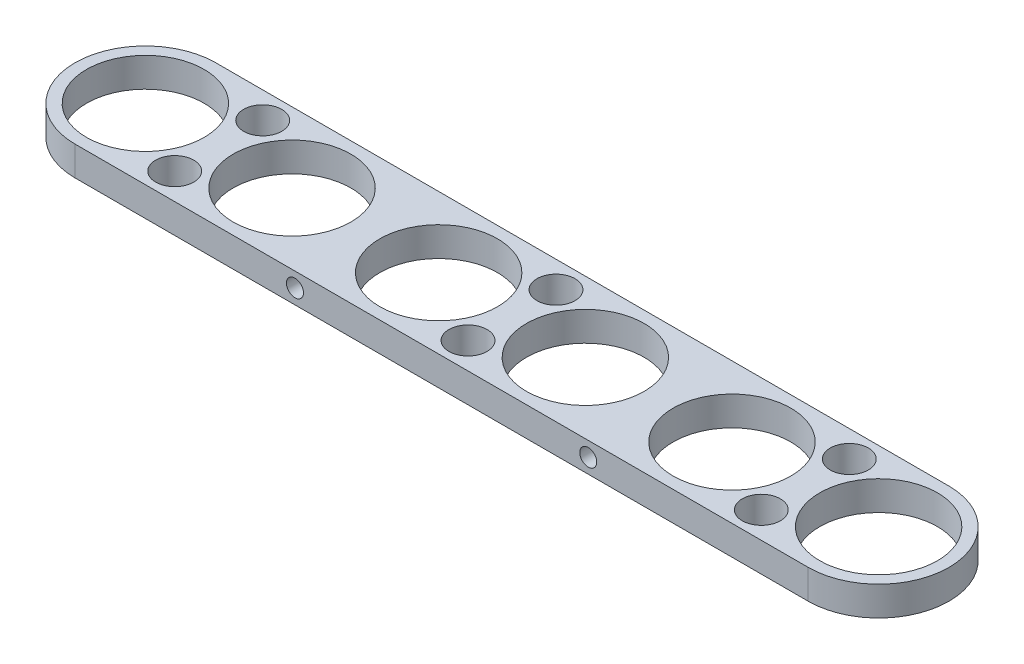
ISO-10303-21;
HEADER;
FILE_DESCRIPTION(('STEP AP214'),'2;1');
FILE_NAME('part.step','',(''),(''),'','','');
FILE_SCHEMA(('AUTOMOTIVE_DESIGN { 1 0 10303 214 1 1 1 1 }'));
ENDSEC;
DATA;
#1=APPLICATION_CONTEXT('core data for automotive mechanical design processes');
#2=APPLICATION_PROTOCOL_DEFINITION('international standard','automotive_design',2000,#1);
#3=PRODUCT_CONTEXT('',#1,'mechanical');
#4=PRODUCT('Part','Part','',(#3));
#5=PRODUCT_RELATED_PRODUCT_CATEGORY('part','',(#4));
#6=PRODUCT_DEFINITION_FORMATION('','',#4);
#7=PRODUCT_DEFINITION_CONTEXT('part definition',#1,'design');
#8=PRODUCT_DEFINITION('design','',#6,#7);
#9=PRODUCT_DEFINITION_SHAPE('','',#8);
#10=(LENGTH_UNIT() NAMED_UNIT(*) SI_UNIT(.MILLI.,.METRE.));
#11=(NAMED_UNIT(*) PLANE_ANGLE_UNIT() SI_UNIT($,.RADIAN.));
#12=(NAMED_UNIT(*) SI_UNIT($,.STERADIAN.) SOLID_ANGLE_UNIT());
#13=UNCERTAINTY_MEASURE_WITH_UNIT(LENGTH_MEASURE(1.E-05),#10,'distance_accuracy_value','');
#14=(GEOMETRIC_REPRESENTATION_CONTEXT(3) GLOBAL_UNCERTAINTY_ASSIGNED_CONTEXT((#13)) GLOBAL_UNIT_ASSIGNED_CONTEXT((#10,
#11,#12)) REPRESENTATION_CONTEXT('',''));
#15=CARTESIAN_POINT('',(0.,0.,0.));
#16=DIRECTION('',(0.,0.,1.));
#17=DIRECTION('',(1.,0.,0.));
#18=AXIS2_PLACEMENT_3D('',#15,#16,#17);
#19=CARTESIAN_POINT('',(0.,6.35,0.));
#20=DIRECTION('',(0.,1.,0.));
#21=DIRECTION('',(0.,0.,1.));
#22=AXIS2_PLACEMENT_3D('',#19,#20,#21);
#23=PLANE('',#22);
#24=CARTESIAN_POINT('',(142.875,6.35,9.525));
#25=DIRECTION('',(0.,1.,0.));
#26=DIRECTION('',(0.,0.,1.));
#27=AXIS2_PLACEMENT_3D('',#24,#25,#26);
#28=CIRCLE('',#27,4.1275);
#29=CARTESIAN_POINT('',(142.875,6.35,13.6525));
#30=VERTEX_POINT('',#29);
#31=EDGE_CURVE('E168',#30,#30,#28,.T.);
#32=ORIENTED_EDGE('',*,*,#31,.F.);
#33=EDGE_LOOP('',(#32));
#34=FACE_BOUND('',#33,.T.);
#35=CARTESIAN_POINT('',(79.375,6.35,9.525));
#36=DIRECTION('',(0.,1.,0.));
#37=DIRECTION('',(0.,0.,1.));
#38=AXIS2_PLACEMENT_3D('',#35,#36,#37);
#39=CIRCLE('',#38,4.1275);
#40=CARTESIAN_POINT('',(79.375,6.35,13.6525));
#41=VERTEX_POINT('',#40);
#42=EDGE_CURVE('E156',#41,#41,#39,.T.);
#43=ORIENTED_EDGE('',*,*,#42,.F.);
#44=EDGE_LOOP('',(#43));
#45=FACE_BOUND('',#44,.T.);
#46=CARTESIAN_POINT('',(15.875,6.35,9.525));
#47=DIRECTION('',(0.,1.,0.));
#48=DIRECTION('',(0.,0.,1.));
#49=AXIS2_PLACEMENT_3D('',#46,#47,#48);
#50=CIRCLE('',#49,4.1275);
#51=CARTESIAN_POINT('',(15.875,6.35,13.6525));
#52=VERTEX_POINT('',#51);
#53=EDGE_CURVE('E144',#52,#52,#50,.T.);
#54=ORIENTED_EDGE('',*,*,#53,.F.);
#55=EDGE_LOOP('',(#54));
#56=FACE_BOUND('',#55,.T.);
#57=CARTESIAN_POINT('',(127.,6.35,0.));
#58=DIRECTION('',(0.,1.,0.));
#59=DIRECTION('',(0.,0.,1.));
#60=AXIS2_PLACEMENT_3D('',#57,#58,#59);
#61=CIRCLE('',#60,12.744080559871);
#62=CARTESIAN_POINT('',(127.,6.35,12.744080559871));
#63=VERTEX_POINT('',#62);
#64=EDGE_CURVE('E132',#63,#63,#61,.T.);
#65=ORIENTED_EDGE('',*,*,#64,.F.);
#66=EDGE_LOOP('',(#65));
#67=FACE_BOUND('',#66,.T.);
#68=CARTESIAN_POINT('',(63.5,6.35,0.));
#69=DIRECTION('',(0.,1.,0.));
#70=DIRECTION('',(0.,0.,1.));
#71=AXIS2_PLACEMENT_3D('',#68,#69,#70);
#72=CIRCLE('',#71,12.744080559871);
#73=CARTESIAN_POINT('',(63.5,6.35,12.744080559871));
#74=VERTEX_POINT('',#73);
#75=EDGE_CURVE('E120',#74,#74,#72,.T.);
#76=ORIENTED_EDGE('',*,*,#75,.F.);
#77=EDGE_LOOP('',(#76));
#78=FACE_BOUND('',#77,.T.);
#79=CARTESIAN_POINT('',(0.,6.35,0.));
#80=DIRECTION('',(0.,1.,0.));
#81=DIRECTION('',(0.,0.,1.));
#82=AXIS2_PLACEMENT_3D('',#79,#80,#81);
#83=CIRCLE('',#82,12.744080559871);
#84=CARTESIAN_POINT('',(0.,6.35,12.744080559871));
#85=VERTEX_POINT('',#84);
#86=EDGE_CURVE('E99',#85,#85,#83,.T.);
#87=ORIENTED_EDGE('',*,*,#86,.F.);
#88=EDGE_LOOP('',(#87));
#89=FACE_BOUND('',#88,.T.);
#90=CARTESIAN_POINT('',(0.,6.35,0.));
#91=DIRECTION('',(0.,1.,0.));
#92=DIRECTION('',(0.,0.,1.));
#93=AXIS2_PLACEMENT_3D('',#90,#91,#92);
#94=CIRCLE('',#93,15.24);
#95=CARTESIAN_POINT('',(0.,6.35,-15.24));
#96=VERTEX_POINT('',#95);
#97=CARTESIAN_POINT('',(0.,6.35,15.24));
#98=VERTEX_POINT('',#97);
#99=EDGE_CURVE('E84',#96,#98,#94,.T.);
#100=ORIENTED_EDGE('',*,*,#99,.T.);
#101=DIRECTION('',(1.,0.,0.));
#102=VECTOR('',#101,1.);
#103=CARTESIAN_POINT('',(0.,6.35,15.24));
#104=LINE('',#103,#102);
#105=CARTESIAN_POINT('',(158.75,6.35,15.24));
#106=VERTEX_POINT('',#105);
#107=EDGE_CURVE('E79',#98,#106,#104,.T.);
#108=ORIENTED_EDGE('',*,*,#107,.T.);
#109=CARTESIAN_POINT('',(158.75,6.35,0.));
#110=DIRECTION('',(0.,1.,0.));
#111=DIRECTION('',(0.,0.,1.));
#112=AXIS2_PLACEMENT_3D('',#109,#110,#111);
#113=CIRCLE('',#112,15.24);
#114=CARTESIAN_POINT('',(158.75,6.35,-15.24));
#115=VERTEX_POINT('',#114);
#116=EDGE_CURVE('E82',#106,#115,#113,.T.);
#117=ORIENTED_EDGE('',*,*,#116,.T.);
#118=DIRECTION('',(-1.,0.,0.));
#119=VECTOR('',#118,1.);
#120=CARTESIAN_POINT('',(0.,6.35,-15.24));
#121=LINE('',#120,#119);
#122=EDGE_CURVE('E49',#115,#96,#121,.T.);
#123=ORIENTED_EDGE('',*,*,#122,.T.);
#124=EDGE_LOOP('',(#100,#108,#117,#123));
#125=FACE_BOUND('',#124,.T.);
#126=CARTESIAN_POINT('',(31.75,6.35,0.));
#127=DIRECTION('',(0.,1.,0.));
#128=DIRECTION('',(0.,0.,1.));
#129=AXIS2_PLACEMENT_3D('',#126,#127,#128);
#130=CIRCLE('',#129,12.744080559871);
#131=CARTESIAN_POINT('',(31.75,6.35,12.744080559871));
#132=VERTEX_POINT('',#131);
#133=EDGE_CURVE('E114',#132,#132,#130,.T.);
#134=ORIENTED_EDGE('',*,*,#133,.F.);
#135=EDGE_LOOP('',(#134));
#136=FACE_BOUND('',#135,.T.);
#137=CARTESIAN_POINT('',(95.25,6.35,0.));
#138=DIRECTION('',(0.,1.,0.));
#139=DIRECTION('',(0.,0.,1.));
#140=AXIS2_PLACEMENT_3D('',#137,#138,#139);
#141=CIRCLE('',#140,12.744080559871);
#142=CARTESIAN_POINT('',(95.25,6.35,12.744080559871));
#143=VERTEX_POINT('',#142);
#144=EDGE_CURVE('E126',#143,#143,#141,.T.);
#145=ORIENTED_EDGE('',*,*,#144,.F.);
#146=EDGE_LOOP('',(#145));
#147=FACE_BOUND('',#146,.T.);
#148=CARTESIAN_POINT('',(158.75,6.35,0.));
#149=DIRECTION('',(0.,1.,0.));
#150=DIRECTION('',(0.,0.,1.));
#151=AXIS2_PLACEMENT_3D('',#148,#149,#150);
#152=CIRCLE('',#151,12.744080559871);
#153=CARTESIAN_POINT('',(158.75,6.35,12.744080559871));
#154=VERTEX_POINT('',#153);
#155=EDGE_CURVE('E138',#154,#154,#152,.T.);
#156=ORIENTED_EDGE('',*,*,#155,.F.);
#157=EDGE_LOOP('',(#156));
#158=FACE_BOUND('',#157,.T.);
#159=CARTESIAN_POINT('',(15.875,6.35,-9.525));
#160=DIRECTION('',(0.,1.,0.));
#161=DIRECTION('',(0.,0.,-1.));
#162=AXIS2_PLACEMENT_3D('',#159,#160,#161);
#163=CIRCLE('',#162,4.12749999999999);
#164=CARTESIAN_POINT('',(15.875,6.35,-13.6525));
#165=VERTEX_POINT('',#164);
#166=EDGE_CURVE('E150',#165,#165,#163,.T.);
#167=ORIENTED_EDGE('',*,*,#166,.F.);
#168=EDGE_LOOP('',(#167));
#169=FACE_BOUND('',#168,.T.);
#170=CARTESIAN_POINT('',(79.375,6.35,-9.525));
#171=DIRECTION('',(0.,1.,0.));
#172=DIRECTION('',(0.,0.,-1.));
#173=AXIS2_PLACEMENT_3D('',#170,#171,#172);
#174=CIRCLE('',#173,4.12749999999998);
#175=CARTESIAN_POINT('',(79.375,6.35,-13.6525));
#176=VERTEX_POINT('',#175);
#177=EDGE_CURVE('E162',#176,#176,#174,.T.);
#178=ORIENTED_EDGE('',*,*,#177,.F.);
#179=EDGE_LOOP('',(#178));
#180=FACE_BOUND('',#179,.T.);
#181=CARTESIAN_POINT('',(142.875,6.35,-9.525));
#182=DIRECTION('',(0.,1.,0.));
#183=DIRECTION('',(0.,0.,-1.));
#184=AXIS2_PLACEMENT_3D('',#181,#182,#183);
#185=CIRCLE('',#184,4.1275);
#186=CARTESIAN_POINT('',(142.875,6.35,-13.6525));
#187=VERTEX_POINT('',#186);
#188=EDGE_CURVE('E174',#187,#187,#185,.T.);
#189=ORIENTED_EDGE('',*,*,#188,.F.);
#190=EDGE_LOOP('',(#189));
#191=FACE_BOUND('',#190,.T.);
#192=ADVANCED_FACE('F32',(#34,#45,#56,#67,#78,#89,#125,#136,#147,#158,#169,#180,#191),#23,.T.);
#193=CARTESIAN_POINT('',(0.,0.,0.));
#194=DIRECTION('',(0.,1.,0.));
#195=DIRECTION('',(0.,0.,1.));
#196=AXIS2_PLACEMENT_3D('',#193,#194,#195);
#197=PLANE('',#196);
#198=CARTESIAN_POINT('',(0.,0.,0.));
#199=DIRECTION('',(0.,1.,0.));
#200=DIRECTION('',(0.,0.,1.));
#201=AXIS2_PLACEMENT_3D('',#198,#199,#200);
#202=CIRCLE('',#201,15.24);
#203=CARTESIAN_POINT('',(0.,0.,-15.24));
#204=VERTEX_POINT('',#203);
#205=CARTESIAN_POINT('',(0.,0.,15.24));
#206=VERTEX_POINT('',#205);
#207=EDGE_CURVE('E96',#204,#206,#202,.T.);
#208=ORIENTED_EDGE('',*,*,#207,.F.);
#209=DIRECTION('',(-1.,0.,0.));
#210=VECTOR('',#209,1.);
#211=CARTESIAN_POINT('',(0.,0.,-15.24));
#212=LINE('',#211,#210);
#213=CARTESIAN_POINT('',(158.75,0.,-15.24));
#214=VERTEX_POINT('',#213);
#215=EDGE_CURVE('E72',#214,#204,#212,.T.);
#216=ORIENTED_EDGE('',*,*,#215,.F.);
#217=CARTESIAN_POINT('',(158.75,0.,0.));
#218=DIRECTION('',(0.,1.,0.));
#219=DIRECTION('',(0.,0.,1.));
#220=AXIS2_PLACEMENT_3D('',#217,#218,#219);
#221=CIRCLE('',#220,15.24);
#222=CARTESIAN_POINT('',(158.75,0.,15.24));
#223=VERTEX_POINT('',#222);
#224=EDGE_CURVE('E66',#223,#214,#221,.T.);
#225=ORIENTED_EDGE('',*,*,#224,.F.);
#226=DIRECTION('',(1.,0.,0.));
#227=VECTOR('',#226,1.);
#228=CARTESIAN_POINT('',(0.,0.,15.24));
#229=LINE('',#228,#227);
#230=EDGE_CURVE('E88',#206,#223,#229,.T.);
#231=ORIENTED_EDGE('',*,*,#230,.F.);
#232=EDGE_LOOP('',(#208,#216,#225,#231));
#233=FACE_BOUND('',#232,.T.);
#234=CARTESIAN_POINT('',(0.,0.,0.));
#235=DIRECTION('',(0.,1.,0.));
#236=DIRECTION('',(0.,0.,1.));
#237=AXIS2_PLACEMENT_3D('',#234,#235,#236);
#238=CIRCLE('',#237,12.744080559871);
#239=CARTESIAN_POINT('',(0.,0.,12.744080559871));
#240=VERTEX_POINT('',#239);
#241=EDGE_CURVE('E111',#240,#240,#238,.T.);
#242=ORIENTED_EDGE('',*,*,#241,.T.);
#243=EDGE_LOOP('',(#242));
#244=FACE_BOUND('',#243,.T.);
#245=CARTESIAN_POINT('',(31.75,0.,0.));
#246=DIRECTION('',(0.,1.,0.));
#247=DIRECTION('',(0.,0.,1.));
#248=AXIS2_PLACEMENT_3D('',#245,#246,#247);
#249=CIRCLE('',#248,12.744080559871);
#250=CARTESIAN_POINT('',(31.75,0.,12.744080559871));
#251=VERTEX_POINT('',#250);
#252=EDGE_CURVE('E117',#251,#251,#249,.T.);
#253=ORIENTED_EDGE('',*,*,#252,.T.);
#254=EDGE_LOOP('',(#253));
#255=FACE_BOUND('',#254,.T.);
#256=CARTESIAN_POINT('',(63.5,0.,0.));
#257=DIRECTION('',(0.,1.,0.));
#258=DIRECTION('',(0.,0.,1.));
#259=AXIS2_PLACEMENT_3D('',#256,#257,#258);
#260=CIRCLE('',#259,12.744080559871);
#261=CARTESIAN_POINT('',(63.5,0.,12.744080559871));
#262=VERTEX_POINT('',#261);
#263=EDGE_CURVE('E123',#262,#262,#260,.T.);
#264=ORIENTED_EDGE('',*,*,#263,.T.);
#265=EDGE_LOOP('',(#264));
#266=FACE_BOUND('',#265,.T.);
#267=CARTESIAN_POINT('',(95.25,0.,0.));
#268=DIRECTION('',(0.,1.,0.));
#269=DIRECTION('',(0.,0.,1.));
#270=AXIS2_PLACEMENT_3D('',#267,#268,#269);
#271=CIRCLE('',#270,12.744080559871);
#272=CARTESIAN_POINT('',(95.25,0.,12.744080559871));
#273=VERTEX_POINT('',#272);
#274=EDGE_CURVE('E129',#273,#273,#271,.T.);
#275=ORIENTED_EDGE('',*,*,#274,.T.);
#276=EDGE_LOOP('',(#275));
#277=FACE_BOUND('',#276,.T.);
#278=CARTESIAN_POINT('',(127.,0.,0.));
#279=DIRECTION('',(0.,1.,0.));
#280=DIRECTION('',(0.,0.,1.));
#281=AXIS2_PLACEMENT_3D('',#278,#279,#280);
#282=CIRCLE('',#281,12.744080559871);
#283=CARTESIAN_POINT('',(127.,0.,12.744080559871));
#284=VERTEX_POINT('',#283);
#285=EDGE_CURVE('E135',#284,#284,#282,.T.);
#286=ORIENTED_EDGE('',*,*,#285,.T.);
#287=EDGE_LOOP('',(#286));
#288=FACE_BOUND('',#287,.T.);
#289=CARTESIAN_POINT('',(158.75,0.,0.));
#290=DIRECTION('',(0.,1.,0.));
#291=DIRECTION('',(0.,0.,1.));
#292=AXIS2_PLACEMENT_3D('',#289,#290,#291);
#293=CIRCLE('',#292,12.744080559871);
#294=CARTESIAN_POINT('',(158.75,0.,12.744080559871));
#295=VERTEX_POINT('',#294);
#296=EDGE_CURVE('E141',#295,#295,#293,.T.);
#297=ORIENTED_EDGE('',*,*,#296,.T.);
#298=EDGE_LOOP('',(#297));
#299=FACE_BOUND('',#298,.T.);
#300=CARTESIAN_POINT('',(15.875,0.,9.525));
#301=DIRECTION('',(0.,1.,0.));
#302=DIRECTION('',(0.,0.,1.));
#303=AXIS2_PLACEMENT_3D('',#300,#301,#302);
#304=CIRCLE('',#303,4.1275);
#305=CARTESIAN_POINT('',(15.875,0.,13.6525));
#306=VERTEX_POINT('',#305);
#307=EDGE_CURVE('E147',#306,#306,#304,.T.);
#308=ORIENTED_EDGE('',*,*,#307,.T.);
#309=EDGE_LOOP('',(#308));
#310=FACE_BOUND('',#309,.T.);
#311=CARTESIAN_POINT('',(15.875,0.,-9.525));
#312=DIRECTION('',(0.,1.,0.));
#313=DIRECTION('',(0.,0.,-1.));
#314=AXIS2_PLACEMENT_3D('',#311,#312,#313);
#315=CIRCLE('',#314,4.12749999999999);
#316=CARTESIAN_POINT('',(15.875,0.,-13.6525));
#317=VERTEX_POINT('',#316);
#318=EDGE_CURVE('E153',#317,#317,#315,.T.);
#319=ORIENTED_EDGE('',*,*,#318,.T.);
#320=EDGE_LOOP('',(#319));
#321=FACE_BOUND('',#320,.T.);
#322=CARTESIAN_POINT('',(79.375,0.,9.525));
#323=DIRECTION('',(0.,1.,0.));
#324=DIRECTION('',(0.,0.,1.));
#325=AXIS2_PLACEMENT_3D('',#322,#323,#324);
#326=CIRCLE('',#325,4.1275);
#327=CARTESIAN_POINT('',(79.375,0.,13.6525));
#328=VERTEX_POINT('',#327);
#329=EDGE_CURVE('E159',#328,#328,#326,.T.);
#330=ORIENTED_EDGE('',*,*,#329,.T.);
#331=EDGE_LOOP('',(#330));
#332=FACE_BOUND('',#331,.T.);
#333=CARTESIAN_POINT('',(79.375,0.,-9.525));
#334=DIRECTION('',(0.,1.,0.));
#335=DIRECTION('',(0.,0.,-1.));
#336=AXIS2_PLACEMENT_3D('',#333,#334,#335);
#337=CIRCLE('',#336,4.12749999999998);
#338=CARTESIAN_POINT('',(79.375,0.,-13.6525));
#339=VERTEX_POINT('',#338);
#340=EDGE_CURVE('E165',#339,#339,#337,.T.);
#341=ORIENTED_EDGE('',*,*,#340,.T.);
#342=EDGE_LOOP('',(#341));
#343=FACE_BOUND('',#342,.T.);
#344=CARTESIAN_POINT('',(142.875,0.,9.525));
#345=DIRECTION('',(0.,1.,0.));
#346=DIRECTION('',(0.,0.,1.));
#347=AXIS2_PLACEMENT_3D('',#344,#345,#346);
#348=CIRCLE('',#347,4.1275);
#349=CARTESIAN_POINT('',(142.875,0.,13.6525));
#350=VERTEX_POINT('',#349);
#351=EDGE_CURVE('E171',#350,#350,#348,.T.);
#352=ORIENTED_EDGE('',*,*,#351,.T.);
#353=EDGE_LOOP('',(#352));
#354=FACE_BOUND('',#353,.T.);
#355=CARTESIAN_POINT('',(142.875,0.,-9.525));
#356=DIRECTION('',(0.,1.,0.));
#357=DIRECTION('',(0.,0.,-1.));
#358=AXIS2_PLACEMENT_3D('',#355,#356,#357);
#359=CIRCLE('',#358,4.1275);
#360=CARTESIAN_POINT('',(142.875,0.,-13.6525));
#361=VERTEX_POINT('',#360);
#362=EDGE_CURVE('E177',#361,#361,#359,.T.);
#363=ORIENTED_EDGE('',*,*,#362,.T.);
#364=EDGE_LOOP('',(#363));
#365=FACE_BOUND('',#364,.T.);
#366=ADVANCED_FACE('F107',(#233,#244,#255,#266,#277,#288,#299,#310,#321,#332,#343,#354,#365),
#197,.F.);
#367=CARTESIAN_POINT('',(0.,6.35,0.));
#368=DIRECTION('',(0.,-1.,0.));
#369=DIRECTION('',(0.,0.,-1.));
#370=AXIS2_PLACEMENT_3D('',#367,#368,#369);
#371=CYLINDRICAL_SURFACE('',#370,15.24);
#372=ORIENTED_EDGE('',*,*,#207,.T.);
#373=DIRECTION('',(0.,-1.,0.));
#374=VECTOR('',#373,1.);
#375=CARTESIAN_POINT('',(0.,6.35,15.24));
#376=LINE('',#375,#374);
#377=EDGE_CURVE('E11',#98,#206,#376,.T.);
#378=ORIENTED_EDGE('',*,*,#377,.F.);
#379=ORIENTED_EDGE('',*,*,#99,.F.);
#380=DIRECTION('',(0.,-1.,0.));
#381=VECTOR('',#380,1.);
#382=CARTESIAN_POINT('',(0.,6.35,-15.24));
#383=LINE('',#382,#381);
#384=EDGE_CURVE('E92',#96,#204,#383,.T.);
#385=ORIENTED_EDGE('',*,*,#384,.T.);
#386=EDGE_LOOP('',(#372,#378,#379,#385));
#387=FACE_BOUND('',#386,.T.);
#388=ADVANCED_FACE('F34',(#387),#371,.T.);
#389=CARTESIAN_POINT('',(0.,6.35,15.24));
#390=DIRECTION('',(0.,0.,-1.));
#391=DIRECTION('',(-1.,0.,0.));
#392=AXIS2_PLACEMENT_3D('',#389,#390,#391);
#393=PLANE('',#392);
#394=CARTESIAN_POINT('',(47.6250000000001,3.175,15.24));
#395=DIRECTION('',(0.,0.,-1.));
#396=DIRECTION('',(1.,0.,0.));
#397=AXIS2_PLACEMENT_3D('',#394,#395,#396);
#398=CIRCLE('',#397,1.8415);
#399=CARTESIAN_POINT('',(45.7835000000001,3.175,15.24));
#400=VERTEX_POINT('',#399);
#401=EDGE_CURVE('E186',#400,#400,#398,.T.);
#402=ORIENTED_EDGE('',*,*,#401,.T.);
#403=EDGE_LOOP('',(#402));
#404=FACE_BOUND('',#403,.T.);
#405=CARTESIAN_POINT('',(111.125,3.175,15.24));
#406=DIRECTION('',(0.,0.,-1.));
#407=DIRECTION('',(-1.,0.,0.));
#408=AXIS2_PLACEMENT_3D('',#405,#406,#407);
#409=CIRCLE('',#408,1.8415);
#410=CARTESIAN_POINT('',(109.2835,3.175,15.24));
#411=VERTEX_POINT('',#410);
#412=EDGE_CURVE('E180',#411,#411,#409,.T.);
#413=ORIENTED_EDGE('',*,*,#412,.T.);
#414=EDGE_LOOP('',(#413));
#415=FACE_BOUND('',#414,.T.);
#416=ORIENTED_EDGE('',*,*,#230,.T.);
#417=DIRECTION('',(0.,-1.,0.));
#418=VECTOR('',#417,1.);
#419=CARTESIAN_POINT('',(158.75,6.35,15.24));
#420=LINE('',#419,#418);
#421=EDGE_CURVE('E41',#106,#223,#420,.T.);
#422=ORIENTED_EDGE('',*,*,#421,.F.);
#423=ORIENTED_EDGE('',*,*,#107,.F.);
#424=ORIENTED_EDGE('',*,*,#377,.T.);
#425=EDGE_LOOP('',(#416,#422,#423,#424));
#426=FACE_BOUND('',#425,.T.);
#427=ADVANCED_FACE('F87',(#404,#415,#426),#393,.F.);
#428=CARTESIAN_POINT('',(158.75,6.35,0.));
#429=DIRECTION('',(0.,-1.,0.));
#430=DIRECTION('',(0.,0.,-1.));
#431=AXIS2_PLACEMENT_3D('',#428,#429,#430);
#432=CYLINDRICAL_SURFACE('',#431,15.24);
#433=ORIENTED_EDGE('',*,*,#224,.T.);
#434=DIRECTION('',(0.,-1.,0.));
#435=VECTOR('',#434,1.);
#436=CARTESIAN_POINT('',(158.75,6.35,-15.24));
#437=LINE('',#436,#435);
#438=EDGE_CURVE('E89',#115,#214,#437,.T.);
#439=ORIENTED_EDGE('',*,*,#438,.F.);
#440=ORIENTED_EDGE('',*,*,#116,.F.);
#441=ORIENTED_EDGE('',*,*,#421,.T.);
#442=EDGE_LOOP('',(#433,#439,#440,#441));
#443=FACE_BOUND('',#442,.T.);
#444=ADVANCED_FACE('F90',(#443),#432,.T.);
#445=CARTESIAN_POINT('',(0.,6.35,-15.24));
#446=DIRECTION('',(0.,0.,1.));
#447=DIRECTION('',(1.,0.,0.));
#448=AXIS2_PLACEMENT_3D('',#445,#446,#447);
#449=PLANE('',#448);
#450=CARTESIAN_POINT('',(47.6250000000001,3.175,-15.24));
#451=DIRECTION('',(0.,0.,-1.));
#452=DIRECTION('',(1.,0.,0.));
#453=AXIS2_PLACEMENT_3D('',#450,#451,#452);
#454=CIRCLE('',#453,1.8415);
#455=CARTESIAN_POINT('',(45.7835000000001,3.175,-15.24));
#456=VERTEX_POINT('',#455);
#457=EDGE_CURVE('E189',#456,#456,#454,.T.);
#458=ORIENTED_EDGE('',*,*,#457,.F.);
#459=EDGE_LOOP('',(#458));
#460=FACE_BOUND('',#459,.T.);
#461=CARTESIAN_POINT('',(111.125,3.175,-15.24));
#462=DIRECTION('',(0.,0.,-1.));
#463=DIRECTION('',(-1.,0.,0.));
#464=AXIS2_PLACEMENT_3D('',#461,#462,#463);
#465=CIRCLE('',#464,1.8415);
#466=CARTESIAN_POINT('',(109.2835,3.175,-15.24));
#467=VERTEX_POINT('',#466);
#468=EDGE_CURVE('E183',#467,#467,#465,.T.);
#469=ORIENTED_EDGE('',*,*,#468,.F.);
#470=EDGE_LOOP('',(#469));
#471=FACE_BOUND('',#470,.T.);
#472=ORIENTED_EDGE('',*,*,#215,.T.);
#473=ORIENTED_EDGE('',*,*,#384,.F.);
#474=ORIENTED_EDGE('',*,*,#122,.F.);
#475=ORIENTED_EDGE('',*,*,#438,.T.);
#476=EDGE_LOOP('',(#472,#473,#474,#475));
#477=FACE_BOUND('',#476,.T.);
#478=ADVANCED_FACE('F104',(#460,#471,#477),#449,.F.);
#479=CARTESIAN_POINT('',(0.,6.35,0.));
#480=DIRECTION('',(0.,-1.,0.));
#481=DIRECTION('',(0.,0.,-1.));
#482=AXIS2_PLACEMENT_3D('',#479,#480,#481);
#483=CYLINDRICAL_SURFACE('',#482,12.744080559871);
#484=ORIENTED_EDGE('',*,*,#86,.T.);
#485=EDGE_LOOP('',(#484));
#486=FACE_BOUND('',#485,.T.);
#487=ORIENTED_EDGE('',*,*,#241,.F.);
#488=EDGE_LOOP('',(#487));
#489=FACE_BOUND('',#488,.T.);
#490=ADVANCED_FACE('F206',(#486,#489),#483,.F.);
#491=CARTESIAN_POINT('',(31.75,6.35,0.));
#492=DIRECTION('',(0.,-1.,0.));
#493=DIRECTION('',(0.,0.,-1.));
#494=AXIS2_PLACEMENT_3D('',#491,#492,#493);
#495=CYLINDRICAL_SURFACE('',#494,12.744080559871);
#496=ORIENTED_EDGE('',*,*,#133,.T.);
#497=EDGE_LOOP('',(#496));
#498=FACE_BOUND('',#497,.T.);
#499=ORIENTED_EDGE('',*,*,#252,.F.);
#500=EDGE_LOOP('',(#499));
#501=FACE_BOUND('',#500,.T.);
#502=ADVANCED_FACE('F275',(#498,#501),#495,.F.);
#503=CARTESIAN_POINT('',(63.5,6.35,0.));
#504=DIRECTION('',(0.,-1.,0.));
#505=DIRECTION('',(0.,0.,-1.));
#506=AXIS2_PLACEMENT_3D('',#503,#504,#505);
#507=CYLINDRICAL_SURFACE('',#506,12.744080559871);
#508=ORIENTED_EDGE('',*,*,#75,.T.);
#509=EDGE_LOOP('',(#508));
#510=FACE_BOUND('',#509,.T.);
#511=ORIENTED_EDGE('',*,*,#263,.F.);
#512=EDGE_LOOP('',(#511));
#513=FACE_BOUND('',#512,.T.);
#514=ADVANCED_FACE('F283',(#510,#513),#507,.F.);
#515=CARTESIAN_POINT('',(95.25,6.35,0.));
#516=DIRECTION('',(0.,-1.,0.));
#517=DIRECTION('',(0.,0.,-1.));
#518=AXIS2_PLACEMENT_3D('',#515,#516,#517);
#519=CYLINDRICAL_SURFACE('',#518,12.744080559871);
#520=ORIENTED_EDGE('',*,*,#144,.T.);
#521=EDGE_LOOP('',(#520));
#522=FACE_BOUND('',#521,.T.);
#523=ORIENTED_EDGE('',*,*,#274,.F.);
#524=EDGE_LOOP('',(#523));
#525=FACE_BOUND('',#524,.T.);
#526=ADVANCED_FACE('F291',(#522,#525),#519,.F.);
#527=CARTESIAN_POINT('',(127.,6.35,0.));
#528=DIRECTION('',(0.,-1.,0.));
#529=DIRECTION('',(0.,0.,-1.));
#530=AXIS2_PLACEMENT_3D('',#527,#528,#529);
#531=CYLINDRICAL_SURFACE('',#530,12.744080559871);
#532=ORIENTED_EDGE('',*,*,#64,.T.);
#533=EDGE_LOOP('',(#532));
#534=FACE_BOUND('',#533,.T.);
#535=ORIENTED_EDGE('',*,*,#285,.F.);
#536=EDGE_LOOP('',(#535));
#537=FACE_BOUND('',#536,.T.);
#538=ADVANCED_FACE('F300',(#534,#537),#531,.F.);
#539=CARTESIAN_POINT('',(158.75,6.35,0.));
#540=DIRECTION('',(0.,-1.,0.));
#541=DIRECTION('',(0.,0.,-1.));
#542=AXIS2_PLACEMENT_3D('',#539,#540,#541);
#543=CYLINDRICAL_SURFACE('',#542,12.744080559871);
#544=ORIENTED_EDGE('',*,*,#155,.T.);
#545=EDGE_LOOP('',(#544));
#546=FACE_BOUND('',#545,.T.);
#547=ORIENTED_EDGE('',*,*,#296,.F.);
#548=EDGE_LOOP('',(#547));
#549=FACE_BOUND('',#548,.T.);
#550=ADVANCED_FACE('F309',(#546,#549),#543,.F.);
#551=CARTESIAN_POINT('',(15.875,6.35,9.525));
#552=DIRECTION('',(0.,-1.,0.));
#553=DIRECTION('',(0.,0.,-1.));
#554=AXIS2_PLACEMENT_3D('',#551,#552,#553);
#555=CYLINDRICAL_SURFACE('',#554,4.1275);
#556=ORIENTED_EDGE('',*,*,#53,.T.);
#557=EDGE_LOOP('',(#556));
#558=FACE_BOUND('',#557,.T.);
#559=ORIENTED_EDGE('',*,*,#307,.F.);
#560=EDGE_LOOP('',(#559));
#561=FACE_BOUND('',#560,.T.);
#562=ADVANCED_FACE('F318',(#558,#561),#555,.F.);
#563=CARTESIAN_POINT('',(15.875,6.35,-9.525));
#564=DIRECTION('',(0.,-1.,0.));
#565=DIRECTION('',(0.,0.,-1.));
#566=AXIS2_PLACEMENT_3D('',#563,#564,#565);
#567=CYLINDRICAL_SURFACE('',#566,4.12749999999999);
#568=ORIENTED_EDGE('',*,*,#166,.T.);
#569=EDGE_LOOP('',(#568));
#570=FACE_BOUND('',#569,.T.);
#571=ORIENTED_EDGE('',*,*,#318,.F.);
#572=EDGE_LOOP('',(#571));
#573=FACE_BOUND('',#572,.T.);
#574=ADVANCED_FACE('F327',(#570,#573),#567,.F.);
#575=CARTESIAN_POINT('',(79.375,6.35,9.525));
#576=DIRECTION('',(0.,-1.,0.));
#577=DIRECTION('',(0.,0.,-1.));
#578=AXIS2_PLACEMENT_3D('',#575,#576,#577);
#579=CYLINDRICAL_SURFACE('',#578,4.1275);
#580=ORIENTED_EDGE('',*,*,#42,.T.);
#581=EDGE_LOOP('',(#580));
#582=FACE_BOUND('',#581,.T.);
#583=ORIENTED_EDGE('',*,*,#329,.F.);
#584=EDGE_LOOP('',(#583));
#585=FACE_BOUND('',#584,.T.);
#586=ADVANCED_FACE('F336',(#582,#585),#579,.F.);
#587=CARTESIAN_POINT('',(79.375,6.35,-9.525));
#588=DIRECTION('',(0.,-1.,0.));
#589=DIRECTION('',(0.,0.,-1.));
#590=AXIS2_PLACEMENT_3D('',#587,#588,#589);
#591=CYLINDRICAL_SURFACE('',#590,4.12749999999998);
#592=ORIENTED_EDGE('',*,*,#177,.T.);
#593=EDGE_LOOP('',(#592));
#594=FACE_BOUND('',#593,.T.);
#595=ORIENTED_EDGE('',*,*,#340,.F.);
#596=EDGE_LOOP('',(#595));
#597=FACE_BOUND('',#596,.T.);
#598=ADVANCED_FACE('F345',(#594,#597),#591,.F.);
#599=CARTESIAN_POINT('',(142.875,6.35,9.525));
#600=DIRECTION('',(0.,-1.,0.));
#601=DIRECTION('',(0.,0.,-1.));
#602=AXIS2_PLACEMENT_3D('',#599,#600,#601);
#603=CYLINDRICAL_SURFACE('',#602,4.1275);
#604=ORIENTED_EDGE('',*,*,#31,.T.);
#605=EDGE_LOOP('',(#604));
#606=FACE_BOUND('',#605,.T.);
#607=ORIENTED_EDGE('',*,*,#351,.F.);
#608=EDGE_LOOP('',(#607));
#609=FACE_BOUND('',#608,.T.);
#610=ADVANCED_FACE('F217',(#606,#609),#603,.F.);
#611=CARTESIAN_POINT('',(142.875,6.35,-9.525));
#612=DIRECTION('',(0.,-1.,0.));
#613=DIRECTION('',(0.,0.,-1.));
#614=AXIS2_PLACEMENT_3D('',#611,#612,#613);
#615=CYLINDRICAL_SURFACE('',#614,4.1275);
#616=ORIENTED_EDGE('',*,*,#188,.T.);
#617=EDGE_LOOP('',(#616));
#618=FACE_BOUND('',#617,.T.);
#619=ORIENTED_EDGE('',*,*,#362,.F.);
#620=EDGE_LOOP('',(#619));
#621=FACE_BOUND('',#620,.T.);
#622=ADVANCED_FACE('F211',(#618,#621),#615,.F.);
#623=CARTESIAN_POINT('',(111.125,3.175,15.24));
#624=DIRECTION('',(0.,0.,-1.));
#625=DIRECTION('',(-1.,0.,0.));
#626=AXIS2_PLACEMENT_3D('',#623,#624,#625);
#627=CYLINDRICAL_SURFACE('',#626,1.8415);
#628=CARTESIAN_POINT('',(109.2835,3.175,15.24));
#629=CARTESIAN_POINT('',(109.2835,3.175,14.9225));
#630=CARTESIAN_POINT('',(109.2835,3.175,14.605));
#631=CARTESIAN_POINT('',(109.2835,3.175,13.97));
#632=CARTESIAN_POINT('',(109.2835,3.175,13.6525));
#633=CARTESIAN_POINT('',(109.2835,3.175,13.0175));
#634=CARTESIAN_POINT('',(109.2835,3.175,12.7));
#635=CARTESIAN_POINT('',(109.2835,3.175,12.065));
#636=CARTESIAN_POINT('',(109.2835,3.175,11.7475));
#637=CARTESIAN_POINT('',(109.2835,3.175,11.1125));
#638=CARTESIAN_POINT('',(109.2835,3.175,10.795));
#639=CARTESIAN_POINT('',(109.2835,3.175,10.16));
#640=CARTESIAN_POINT('',(109.2835,3.175,9.8425));
#641=CARTESIAN_POINT('',(109.2835,3.175,9.2075));
#642=CARTESIAN_POINT('',(109.2835,3.175,8.89));
#643=CARTESIAN_POINT('',(109.2835,3.175,8.255));
#644=CARTESIAN_POINT('',(109.2835,3.175,7.9375));
#645=CARTESIAN_POINT('',(109.2835,3.175,7.3025));
#646=CARTESIAN_POINT('',(109.2835,3.175,6.985));
#647=CARTESIAN_POINT('',(109.2835,3.175,6.35));
#648=CARTESIAN_POINT('',(109.2835,3.175,6.0325));
#649=CARTESIAN_POINT('',(109.2835,3.175,5.3975));
#650=CARTESIAN_POINT('',(109.2835,3.175,5.08));
#651=CARTESIAN_POINT('',(109.2835,3.175,4.445));
#652=CARTESIAN_POINT('',(109.2835,3.175,4.1275));
#653=CARTESIAN_POINT('',(109.2835,3.175,3.4925));
#654=CARTESIAN_POINT('',(109.2835,3.175,3.175));
#655=CARTESIAN_POINT('',(109.2835,3.175,2.54));
#656=CARTESIAN_POINT('',(109.2835,3.175,2.2225));
#657=CARTESIAN_POINT('',(109.2835,3.175,1.5875));
#658=CARTESIAN_POINT('',(109.2835,3.175,1.27));
#659=CARTESIAN_POINT('',(109.2835,3.175,0.635000000000002));
#660=CARTESIAN_POINT('',(109.2835,3.175,0.317500000000002));
#661=CARTESIAN_POINT('',(109.2835,3.175,-0.317499999999998));
#662=CARTESIAN_POINT('',(109.2835,3.175,-0.634999999999997));
#663=CARTESIAN_POINT('',(109.2835,3.175,-1.27));
#664=CARTESIAN_POINT('',(109.2835,3.175,-1.5875));
#665=CARTESIAN_POINT('',(109.2835,3.175,-2.2225));
#666=CARTESIAN_POINT('',(109.2835,3.175,-2.54));
#667=CARTESIAN_POINT('',(109.2835,3.175,-3.175));
#668=CARTESIAN_POINT('',(109.2835,3.175,-3.4925));
#669=CARTESIAN_POINT('',(109.2835,3.175,-4.1275));
#670=CARTESIAN_POINT('',(109.2835,3.175,-4.445));
#671=CARTESIAN_POINT('',(109.2835,3.175,-5.08));
#672=CARTESIAN_POINT('',(109.2835,3.175,-5.3975));
#673=CARTESIAN_POINT('',(109.2835,3.175,-6.0325));
#674=CARTESIAN_POINT('',(109.2835,3.175,-6.35));
#675=CARTESIAN_POINT('',(109.2835,3.175,-6.985));
#676=CARTESIAN_POINT('',(109.2835,3.175,-7.3025));
#677=CARTESIAN_POINT('',(109.2835,3.175,-7.9375));
#678=CARTESIAN_POINT('',(109.2835,3.175,-8.255));
#679=CARTESIAN_POINT('',(109.2835,3.175,-8.89));
#680=CARTESIAN_POINT('',(109.2835,3.175,-9.2075));
#681=CARTESIAN_POINT('',(109.2835,3.175,-9.8425));
#682=CARTESIAN_POINT('',(109.2835,3.175,-10.16));
#683=CARTESIAN_POINT('',(109.2835,3.175,-10.795));
#684=CARTESIAN_POINT('',(109.2835,3.175,-11.1125));
#685=CARTESIAN_POINT('',(109.2835,3.175,-11.7475));
#686=CARTESIAN_POINT('',(109.2835,3.175,-12.065));
#687=CARTESIAN_POINT('',(109.2835,3.175,-12.7));
#688=CARTESIAN_POINT('',(109.2835,3.175,-13.0175));
#689=CARTESIAN_POINT('',(109.2835,3.175,-13.6525));
#690=CARTESIAN_POINT('',(109.2835,3.175,-13.97));
#691=CARTESIAN_POINT('',(109.2835,3.175,-14.605));
#692=CARTESIAN_POINT('',(109.2835,3.175,-14.9225));
#693=CARTESIAN_POINT('',(109.2835,3.175,-15.24));
#694=B_SPLINE_CURVE_WITH_KNOTS('',3,(#628,#629,#630,#631,#632,#633,#634,#635,#636,#637,#638,
#639,#640,#641,#642,#643,#644,#645,#646,#647,#648,#649,#650,#651,#652,#653,#654,#655,#656,#657,
#658,#659,#660,#661,#662,#663,#664,#665,#666,#667,#668,#669,#670,#671,#672,#673,#674,#675,#676,
#677,#678,#679,#680,#681,#682,#683,#684,#685,#686,#687,#688,#689,#690,#691,#692,#693),
.UNSPECIFIED.,.F.,.F.,(4,2,2,2,2,2,2,2,2,2,2,2,2,2,2,2,2,2,2,2,2,2,2,2,2,2,2,2,2,2,2,2,4),(0.,
0.9525,1.905,2.8575,3.81,4.7625,5.715,6.6675,7.62,8.5725,9.525,10.4775,11.43,12.3825,13.335,
14.2875,15.24,16.1925,17.145,18.0975,19.05,20.0025,20.955,21.9075,22.86,23.8125,24.765,25.7175,
26.67,27.6225,28.575,29.5275,30.48),.UNSPECIFIED.);
#695=EDGE_CURVE('BSEAM200',#411,#467,#694,.T.);
#696=ORIENTED_EDGE('',*,*,#412,.F.);
#697=ORIENTED_EDGE('',*,*,#468,.T.);
#698=ORIENTED_EDGE('',*,*,#695,.T.);
#699=ORIENTED_EDGE('',*,*,#695,.F.);
#700=EDGE_LOOP('',(#696,#698,#697,#699));
#701=FACE_BOUND('',#700,.T.);
#702=ADVANCED_FACE('F200',(#701),#627,.F.);
#703=CARTESIAN_POINT('',(47.6250000000001,3.175,15.24));
#704=DIRECTION('',(0.,0.,-1.));
#705=DIRECTION('',(-1.,0.,0.));
#706=AXIS2_PLACEMENT_3D('',#703,#704,#705);
#707=CYLINDRICAL_SURFACE('',#706,1.8415);
#708=CARTESIAN_POINT('',(45.7835000000001,3.175,15.24));
#709=CARTESIAN_POINT('',(45.7835000000001,3.175,14.9225));
#710=CARTESIAN_POINT('',(45.7835000000001,3.175,14.605));
#711=CARTESIAN_POINT('',(45.7835000000001,3.175,13.97));
#712=CARTESIAN_POINT('',(45.7835000000001,3.175,13.6525));
#713=CARTESIAN_POINT('',(45.7835000000001,3.175,13.0175));
#714=CARTESIAN_POINT('',(45.7835000000001,3.175,12.7));
#715=CARTESIAN_POINT('',(45.7835000000001,3.175,12.065));
#716=CARTESIAN_POINT('',(45.7835000000001,3.175,11.7475));
#717=CARTESIAN_POINT('',(45.7835000000001,3.175,11.1125));
#718=CARTESIAN_POINT('',(45.7835000000001,3.175,10.795));
#719=CARTESIAN_POINT('',(45.7835000000001,3.175,10.16));
#720=CARTESIAN_POINT('',(45.7835000000001,3.175,9.8425));
#721=CARTESIAN_POINT('',(45.7835000000001,3.175,9.2075));
#722=CARTESIAN_POINT('',(45.7835000000001,3.175,8.89));
#723=CARTESIAN_POINT('',(45.7835000000001,3.175,8.255));
#724=CARTESIAN_POINT('',(45.7835000000001,3.175,7.9375));
#725=CARTESIAN_POINT('',(45.7835000000001,3.175,7.3025));
#726=CARTESIAN_POINT('',(45.7835000000001,3.175,6.985));
#727=CARTESIAN_POINT('',(45.7835000000001,3.175,6.35));
#728=CARTESIAN_POINT('',(45.7835000000001,3.175,6.0325));
#729=CARTESIAN_POINT('',(45.7835000000001,3.175,5.3975));
#730=CARTESIAN_POINT('',(45.7835000000001,3.175,5.08));
#731=CARTESIAN_POINT('',(45.7835000000001,3.175,4.445));
#732=CARTESIAN_POINT('',(45.7835000000001,3.175,4.1275));
#733=CARTESIAN_POINT('',(45.7835000000001,3.175,3.4925));
#734=CARTESIAN_POINT('',(45.7835000000001,3.175,3.175));
#735=CARTESIAN_POINT('',(45.7835000000001,3.175,2.54));
#736=CARTESIAN_POINT('',(45.7835000000001,3.175,2.2225));
#737=CARTESIAN_POINT('',(45.7835000000001,3.175,1.5875));
#738=CARTESIAN_POINT('',(45.7835000000001,3.175,1.27));
#739=CARTESIAN_POINT('',(45.7835000000001,3.175,0.635000000000002));
#740=CARTESIAN_POINT('',(45.7835000000001,3.175,0.317500000000002));
#741=CARTESIAN_POINT('',(45.7835000000001,3.175,-0.317499999999998));
#742=CARTESIAN_POINT('',(45.7835000000001,3.175,-0.634999999999997));
#743=CARTESIAN_POINT('',(45.7835000000001,3.175,-1.27));
#744=CARTESIAN_POINT('',(45.7835000000001,3.175,-1.5875));
#745=CARTESIAN_POINT('',(45.7835000000001,3.175,-2.2225));
#746=CARTESIAN_POINT('',(45.7835000000001,3.175,-2.54));
#747=CARTESIAN_POINT('',(45.7835000000001,3.175,-3.175));
#748=CARTESIAN_POINT('',(45.7835000000001,3.175,-3.4925));
#749=CARTESIAN_POINT('',(45.7835000000001,3.175,-4.1275));
#750=CARTESIAN_POINT('',(45.7835000000001,3.175,-4.445));
#751=CARTESIAN_POINT('',(45.7835000000001,3.175,-5.08));
#752=CARTESIAN_POINT('',(45.7835000000001,3.175,-5.3975));
#753=CARTESIAN_POINT('',(45.7835000000001,3.175,-6.0325));
#754=CARTESIAN_POINT('',(45.7835000000001,3.175,-6.35));
#755=CARTESIAN_POINT('',(45.7835000000001,3.175,-6.985));
#756=CARTESIAN_POINT('',(45.7835000000001,3.175,-7.3025));
#757=CARTESIAN_POINT('',(45.7835000000001,3.175,-7.9375));
#758=CARTESIAN_POINT('',(45.7835000000001,3.175,-8.255));
#759=CARTESIAN_POINT('',(45.7835000000001,3.175,-8.89));
#760=CARTESIAN_POINT('',(45.7835000000001,3.175,-9.2075));
#761=CARTESIAN_POINT('',(45.7835000000001,3.175,-9.8425));
#762=CARTESIAN_POINT('',(45.7835000000001,3.175,-10.16));
#763=CARTESIAN_POINT('',(45.7835000000001,3.175,-10.795));
#764=CARTESIAN_POINT('',(45.7835000000001,3.175,-11.1125));
#765=CARTESIAN_POINT('',(45.7835000000001,3.175,-11.7475));
#766=CARTESIAN_POINT('',(45.7835000000001,3.175,-12.065));
#767=CARTESIAN_POINT('',(45.7835000000001,3.175,-12.7));
#768=CARTESIAN_POINT('',(45.7835000000001,3.175,-13.0175));
#769=CARTESIAN_POINT('',(45.7835000000001,3.175,-13.6525));
#770=CARTESIAN_POINT('',(45.7835000000001,3.175,-13.97));
#771=CARTESIAN_POINT('',(45.7835000000001,3.175,-14.605));
#772=CARTESIAN_POINT('',(45.7835000000001,3.175,-14.9225));
#773=CARTESIAN_POINT('',(45.7835000000001,3.175,-15.24));
#774=B_SPLINE_CURVE_WITH_KNOTS('',3,(#708,#709,#710,#711,#712,#713,#714,#715,#716,#717,#718,
#719,#720,#721,#722,#723,#724,#725,#726,#727,#728,#729,#730,#731,#732,#733,#734,#735,#736,#737,
#738,#739,#740,#741,#742,#743,#744,#745,#746,#747,#748,#749,#750,#751,#752,#753,#754,#755,#756,
#757,#758,#759,#760,#761,#762,#763,#764,#765,#766,#767,#768,#769,#770,#771,#772,#773),
.UNSPECIFIED.,.F.,.F.,(4,2,2,2,2,2,2,2,2,2,2,2,2,2,2,2,2,2,2,2,2,2,2,2,2,2,2,2,2,2,2,2,4),(0.,
0.9525,1.905,2.8575,3.81,4.7625,5.715,6.6675,7.62,8.5725,9.525,10.4775,11.43,12.3825,13.335,
14.2875,15.24,16.1925,17.145,18.0975,19.05,20.0025,20.955,21.9075,22.86,23.8125,24.765,25.7175,
26.67,27.6225,28.575,29.5275,30.48),.UNSPECIFIED.);
#775=EDGE_CURVE('BSEAM197',#400,#456,#774,.T.);
#776=ORIENTED_EDGE('',*,*,#401,.F.);
#777=ORIENTED_EDGE('',*,*,#457,.T.);
#778=ORIENTED_EDGE('',*,*,#775,.T.);
#779=ORIENTED_EDGE('',*,*,#775,.F.);
#780=EDGE_LOOP('',(#776,#778,#777,#779));
#781=FACE_BOUND('',#780,.T.);
#782=ADVANCED_FACE('F197',(#781),#707,.F.);
#783=CLOSED_SHELL('',(#192,#366,#388,#427,#444,#478,#490,#502,#514,#526,#538,#550,#562,#574,
#586,#598,#610,#622,#702,#782));
#784=MANIFOLD_SOLID_BREP('B2',#783);
#785=ADVANCED_BREP_SHAPE_REPRESENTATION('',(#18,#784),#14);
#786=SHAPE_DEFINITION_REPRESENTATION(#9,#785);
ENDSEC;
END-ISO-10303-21;
